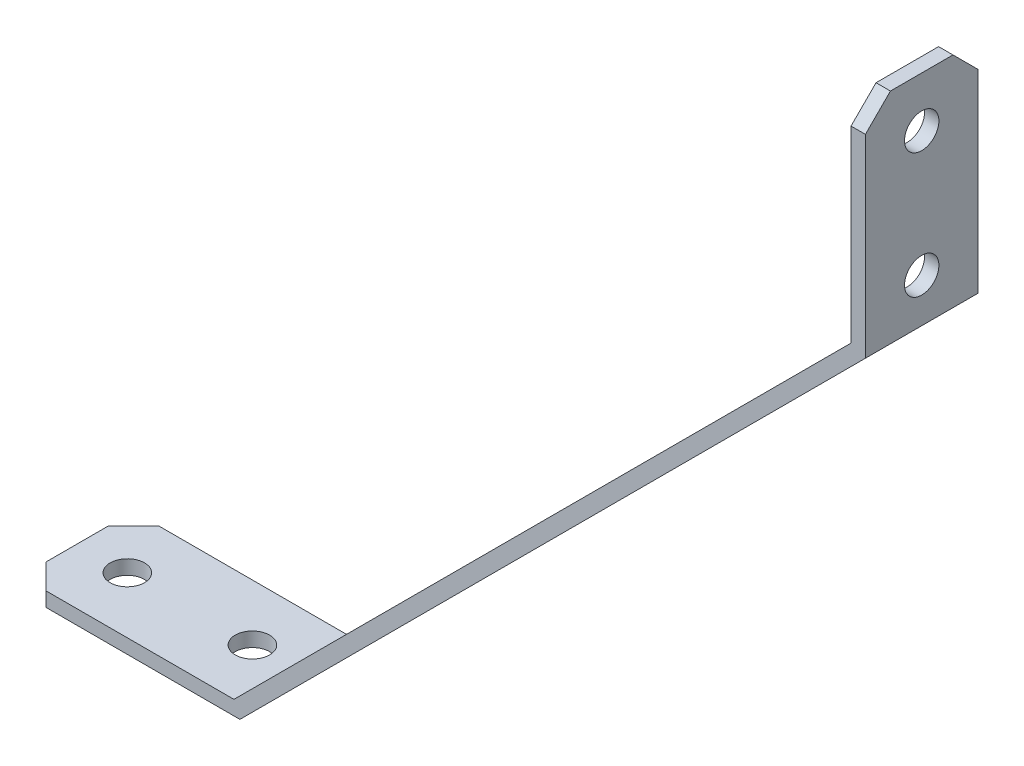
ISO-10303-21;
HEADER;
FILE_DESCRIPTION(('STEP AP214'),'2;1');
FILE_NAME('part.step','',(''),(''),'','','');
FILE_SCHEMA(('AUTOMOTIVE_DESIGN { 1 0 10303 214 1 1 1 1 }'));
ENDSEC;
DATA;
#1=APPLICATION_CONTEXT('core data for automotive mechanical design processes');
#2=APPLICATION_PROTOCOL_DEFINITION('international standard','automotive_design',2000,#1);
#3=PRODUCT_CONTEXT('',#1,'mechanical');
#4=PRODUCT('Part','Part','',(#3));
#5=PRODUCT_RELATED_PRODUCT_CATEGORY('part','',(#4));
#6=PRODUCT_DEFINITION_FORMATION('','',#4);
#7=PRODUCT_DEFINITION_CONTEXT('part definition',#1,'design');
#8=PRODUCT_DEFINITION('design','',#6,#7);
#9=PRODUCT_DEFINITION_SHAPE('','',#8);
#10=(LENGTH_UNIT() NAMED_UNIT(*) SI_UNIT(.MILLI.,.METRE.));
#11=(NAMED_UNIT(*) PLANE_ANGLE_UNIT() SI_UNIT($,.RADIAN.));
#12=(NAMED_UNIT(*) SI_UNIT($,.STERADIAN.) SOLID_ANGLE_UNIT());
#13=UNCERTAINTY_MEASURE_WITH_UNIT(LENGTH_MEASURE(1.E-05),#10,'distance_accuracy_value','');
#14=(GEOMETRIC_REPRESENTATION_CONTEXT(3) GLOBAL_UNCERTAINTY_ASSIGNED_CONTEXT((#13)) GLOBAL_UNIT_ASSIGNED_CONTEXT((#10,
#11,#12)) REPRESENTATION_CONTEXT('',''));
#15=CARTESIAN_POINT('',(0.,0.,0.));
#16=DIRECTION('',(0.,0.,1.));
#17=DIRECTION('',(1.,0.,0.));
#18=AXIS2_PLACEMENT_3D('',#15,#16,#17);
#19=CARTESIAN_POINT('',(0.,2.3,18.));
#20=DIRECTION('',(1.,0.,0.));
#21=DIRECTION('',(0.,1.,0.));
#22=AXIS2_PLACEMENT_3D('',#19,#20,#21);
#23=PLANE('',#22);
#24=DIRECTION('',(0.,0.,-1.));
#25=VECTOR('',#24,1.);
#26=CARTESIAN_POINT('',(0.,2.3,18.));
#27=LINE('',#26,#25);
#28=CARTESIAN_POINT('',(0.,2.3,14.));
#29=VERTEX_POINT('',#28);
#30=CARTESIAN_POINT('',(0.,2.3,4.00000000000001));
#31=VERTEX_POINT('',#30);
#32=EDGE_CURVE('E160',#29,#31,#27,.T.);
#33=ORIENTED_EDGE('',*,*,#32,.T.);
#34=DIRECTION('',(0.,-1.,0.));
#35=VECTOR('',#34,1.);
#36=CARTESIAN_POINT('',(0.,2.3,4.));
#37=LINE('',#36,#35);
#38=CARTESIAN_POINT('',(0.,0.,4.00000000000001));
#39=VERTEX_POINT('',#38);
#40=EDGE_CURVE('E218',#31,#39,#37,.T.);
#41=ORIENTED_EDGE('',*,*,#40,.T.);
#42=DIRECTION('',(0.,0.,-1.));
#43=VECTOR('',#42,1.);
#44=CARTESIAN_POINT('',(0.,0.,18.));
#45=LINE('',#44,#43);
#46=CARTESIAN_POINT('',(0.,0.,14.));
#47=VERTEX_POINT('',#46);
#48=EDGE_CURVE('E143',#47,#39,#45,.T.);
#49=ORIENTED_EDGE('',*,*,#48,.F.);
#50=DIRECTION('',(0.,1.,0.));
#51=VECTOR('',#50,1.);
#52=CARTESIAN_POINT('',(0.,2.3,14.));
#53=LINE('',#52,#51);
#54=EDGE_CURVE('E207',#47,#29,#53,.T.);
#55=ORIENTED_EDGE('',*,*,#54,.T.);
#56=EDGE_LOOP('',(#33,#41,#49,#55));
#57=FACE_BOUND('',#56,.T.);
#58=ADVANCED_FACE('F33',(#57),#23,.F.);
#59=CARTESIAN_POINT('',(0.,0.,18.));
#60=DIRECTION('',(0.,1.,0.));
#61=DIRECTION('',(0.,0.,1.));
#62=AXIS2_PLACEMENT_3D('',#59,#60,#61);
#63=PLANE('',#62);
#64=CARTESIAN_POINT('',(28.,0.,9.));
#65=DIRECTION('',(0.,-1.,0.));
#66=DIRECTION('',(0.,0.,-1.));
#67=AXIS2_PLACEMENT_3D('',#64,#65,#66);
#68=CIRCLE('',#67,2.75);
#69=CARTESIAN_POINT('',(28.,0.,6.25));
#70=VERTEX_POINT('',#69);
#71=EDGE_CURVE('E216',#70,#70,#68,.T.);
#72=ORIENTED_EDGE('',*,*,#71,.F.);
#73=EDGE_LOOP('',(#72));
#74=FACE_BOUND('',#73,.T.);
#75=CARTESIAN_POINT('',(8.00000000000001,0.,9.));
#76=DIRECTION('',(0.,-1.,0.));
#77=DIRECTION('',(0.,0.,-1.));
#78=AXIS2_PLACEMENT_3D('',#75,#76,#77);
#79=CIRCLE('',#78,2.75);
#80=CARTESIAN_POINT('',(8.00000000000001,0.,6.25));
#81=VERTEX_POINT('',#80);
#82=EDGE_CURVE('E212',#81,#81,#79,.T.);
#83=ORIENTED_EDGE('',*,*,#82,.F.);
#84=EDGE_LOOP('',(#83));
#85=FACE_BOUND('',#84,.T.);
#86=ORIENTED_EDGE('',*,*,#48,.T.);
#87=DIRECTION('',(-0.707106781186548,0.,0.707106781186548));
#88=VECTOR('',#87,1.);
#89=CARTESIAN_POINT('',(0.,0.,4.));
#90=LINE('',#89,#88);
#91=CARTESIAN_POINT('',(4.,0.,0.));
#92=VERTEX_POINT('',#91);
#93=EDGE_CURVE('E223',#39,#92,#90,.F.);
#94=ORIENTED_EDGE('',*,*,#93,.T.);
#95=DIRECTION('',(1.,0.,0.));
#96=VECTOR('',#95,1.);
#97=CARTESIAN_POINT('',(0.,0.,0.));
#98=LINE('',#97,#96);
#99=CARTESIAN_POINT('',(35.,0.,0.));
#100=VERTEX_POINT('',#99);
#101=EDGE_CURVE('E140',#92,#100,#98,.T.);
#102=ORIENTED_EDGE('',*,*,#101,.T.);
#103=DIRECTION('',(0.,0.,-1.));
#104=VECTOR('',#103,1.);
#105=CARTESIAN_POINT('',(35.,0.,18.));
#106=LINE('',#105,#104);
#107=CARTESIAN_POINT('',(35.,0.,18.));
#108=VERTEX_POINT('',#107);
#109=EDGE_CURVE('E137',#108,#100,#106,.T.);
#110=ORIENTED_EDGE('',*,*,#109,.F.);
#111=DIRECTION('',(1.,0.,0.));
#112=VECTOR('',#111,1.);
#113=CARTESIAN_POINT('',(0.,0.,18.));
#114=LINE('',#113,#112);
#115=CARTESIAN_POINT('',(4.,0.,18.));
#116=VERTEX_POINT('',#115);
#117=EDGE_CURVE('E125',#116,#108,#114,.T.);
#118=ORIENTED_EDGE('',*,*,#117,.F.);
#119=DIRECTION('',(-0.707106781186548,0.,-0.707106781186548));
#120=VECTOR('',#119,1.);
#121=CARTESIAN_POINT('',(4.,0.,18.));
#122=LINE('',#121,#120);
#123=EDGE_CURVE('E221',#116,#47,#122,.T.);
#124=ORIENTED_EDGE('',*,*,#123,.T.);
#125=EDGE_LOOP('',(#86,#94,#102,#110,#118,#124));
#126=FACE_BOUND('',#125,.T.);
#127=ADVANCED_FACE('F139',(#74,#85,#126),#63,.F.);
#128=CARTESIAN_POINT('',(35.,0.,18.));
#129=DIRECTION('',(-0.707106781186548,0.707106781186547,0.));
#130=DIRECTION('',(-0.707106781186547,-0.707106781186548,0.));
#131=AXIS2_PLACEMENT_3D('',#128,#129,#130);
#132=PLANE('',#131);
#133=DIRECTION('',(0.707106781186547,0.707106781186548,0.));
#134=VECTOR('',#133,1.);
#135=CARTESIAN_POINT('',(35.,0.,0.));
#136=LINE('',#135,#134);
#137=CARTESIAN_POINT('',(135.,100.,0.));
#138=VERTEX_POINT('',#137);
#139=EDGE_CURVE('E162',#100,#138,#136,.T.);
#140=ORIENTED_EDGE('',*,*,#139,.T.);
#141=DIRECTION('',(0.,0.,-1.));
#142=VECTOR('',#141,1.);
#143=CARTESIAN_POINT('',(135.,100.,18.));
#144=LINE('',#143,#142);
#145=CARTESIAN_POINT('',(135.,100.,18.));
#146=VERTEX_POINT('',#145);
#147=EDGE_CURVE('E144',#146,#138,#144,.T.);
#148=ORIENTED_EDGE('',*,*,#147,.F.);
#149=DIRECTION('',(0.707106781186547,0.707106781186548,0.));
#150=VECTOR('',#149,1.);
#151=CARTESIAN_POINT('',(35.,0.,18.));
#152=LINE('',#151,#150);
#153=EDGE_CURVE('E130',#108,#146,#152,.T.);
#154=ORIENTED_EDGE('',*,*,#153,.F.);
#155=ORIENTED_EDGE('',*,*,#109,.T.);
#156=EDGE_LOOP('',(#140,#148,#154,#155));
#157=FACE_BOUND('',#156,.T.);
#158=ADVANCED_FACE('F146',(#157),#132,.F.);
#159=CARTESIAN_POINT('',(135.,100.,18.));
#160=DIRECTION('',(-1.,0.,0.));
#161=DIRECTION('',(0.,-1.,0.));
#162=AXIS2_PLACEMENT_3D('',#159,#160,#161);
#163=PLANE('',#162);
#164=CARTESIAN_POINT('',(135.,107.,9.));
#165=DIRECTION('',(-1.,0.,0.));
#166=DIRECTION('',(0.,0.,1.));
#167=AXIS2_PLACEMENT_3D('',#164,#165,#166);
#168=CIRCLE('',#167,2.75);
#169=CARTESIAN_POINT('',(135.,107.,11.75));
#170=VERTEX_POINT('',#169);
#171=EDGE_CURVE('E422',#170,#170,#168,.T.);
#172=ORIENTED_EDGE('',*,*,#171,.T.);
#173=EDGE_LOOP('',(#172));
#174=FACE_BOUND('',#173,.T.);
#175=CARTESIAN_POINT('',(135.,127.,9.));
#176=DIRECTION('',(-1.,0.,0.));
#177=DIRECTION('',(0.,0.,1.));
#178=AXIS2_PLACEMENT_3D('',#175,#176,#177);
#179=CIRCLE('',#178,2.75);
#180=CARTESIAN_POINT('',(135.,127.,11.75));
#181=VERTEX_POINT('',#180);
#182=EDGE_CURVE('E163',#181,#181,#179,.T.);
#183=ORIENTED_EDGE('',*,*,#182,.T.);
#184=EDGE_LOOP('',(#183));
#185=FACE_BOUND('',#184,.T.);
#186=DIRECTION('',(0.,0.,-1.));
#187=VECTOR('',#186,1.);
#188=CARTESIAN_POINT('',(135.,135.,18.));
#189=LINE('',#188,#187);
#190=CARTESIAN_POINT('',(135.,135.,14.));
#191=VERTEX_POINT('',#190);
#192=CARTESIAN_POINT('',(135.,135.,4.00000000000001));
#193=VERTEX_POINT('',#192);
#194=EDGE_CURVE('E184',#191,#193,#189,.T.);
#195=ORIENTED_EDGE('',*,*,#194,.F.);
#196=DIRECTION('',(0.,-0.707106781186545,0.70710678118655));
#197=VECTOR('',#196,1.);
#198=CARTESIAN_POINT('',(135.,131.,18.));
#199=LINE('',#198,#197);
#200=CARTESIAN_POINT('',(135.,131.,18.));
#201=VERTEX_POINT('',#200);
#202=EDGE_CURVE('E203',#191,#201,#199,.T.);
#203=ORIENTED_EDGE('',*,*,#202,.T.);
#204=DIRECTION('',(0.,1.,0.));
#205=VECTOR('',#204,1.);
#206=CARTESIAN_POINT('',(135.,100.,18.));
#207=LINE('',#206,#205);
#208=EDGE_CURVE('E149',#146,#201,#207,.T.);
#209=ORIENTED_EDGE('',*,*,#208,.F.);
#210=ORIENTED_EDGE('',*,*,#147,.T.);
#211=DIRECTION('',(0.,1.,0.));
#212=VECTOR('',#211,1.);
#213=CARTESIAN_POINT('',(135.,100.,0.));
#214=LINE('',#213,#212);
#215=CARTESIAN_POINT('',(135.,131.,0.));
#216=VERTEX_POINT('',#215);
#217=EDGE_CURVE('E165',#138,#216,#214,.T.);
#218=ORIENTED_EDGE('',*,*,#217,.T.);
#219=DIRECTION('',(0.,-0.707106781186548,-0.707106781186548));
#220=VECTOR('',#219,1.);
#221=CARTESIAN_POINT('',(135.,135.,4.));
#222=LINE('',#221,#220);
#223=EDGE_CURVE('E201',#216,#193,#222,.F.);
#224=ORIENTED_EDGE('',*,*,#223,.T.);
#225=EDGE_LOOP('',(#195,#203,#209,#210,#218,#224));
#226=FACE_BOUND('',#225,.T.);
#227=ADVANCED_FACE('F238',(#174,#185,#226),#163,.F.);
#228=CARTESIAN_POINT('',(135.,135.,18.));
#229=DIRECTION('',(0.,-1.,0.));
#230=DIRECTION('',(0.,0.,-1.));
#231=AXIS2_PLACEMENT_3D('',#228,#229,#230);
#232=PLANE('',#231);
#233=DIRECTION('',(0.,0.,-1.));
#234=VECTOR('',#233,1.);
#235=CARTESIAN_POINT('',(132.7,135.,18.));
#236=LINE('',#235,#234);
#237=CARTESIAN_POINT('',(132.7,135.,14.));
#238=VERTEX_POINT('',#237);
#239=CARTESIAN_POINT('',(132.7,135.,4.00000000000001));
#240=VERTEX_POINT('',#239);
#241=EDGE_CURVE('E181',#238,#240,#236,.T.);
#242=ORIENTED_EDGE('',*,*,#241,.F.);
#243=DIRECTION('',(1.,0.,0.));
#244=VECTOR('',#243,1.);
#245=CARTESIAN_POINT('',(135.,135.,14.));
#246=LINE('',#245,#244);
#247=EDGE_CURVE('E199',#238,#191,#246,.T.);
#248=ORIENTED_EDGE('',*,*,#247,.T.);
#249=ORIENTED_EDGE('',*,*,#194,.T.);
#250=DIRECTION('',(-1.,0.,0.));
#251=VECTOR('',#250,1.);
#252=CARTESIAN_POINT('',(135.,135.,4.));
#253=LINE('',#252,#251);
#254=EDGE_CURVE('E196',#193,#240,#253,.T.);
#255=ORIENTED_EDGE('',*,*,#254,.T.);
#256=EDGE_LOOP('',(#242,#248,#249,#255));
#257=FACE_BOUND('',#256,.T.);
#258=ADVANCED_FACE('F251',(#257),#232,.F.);
#259=CARTESIAN_POINT('',(132.7,135.,18.));
#260=DIRECTION('',(1.,0.,0.));
#261=DIRECTION('',(0.,0.,-1.));
#262=AXIS2_PLACEMENT_3D('',#259,#260,#261);
#263=PLANE('',#262);
#264=CARTESIAN_POINT('',(132.7,107.,9.));
#265=DIRECTION('',(-1.,0.,0.));
#266=DIRECTION('',(0.,0.,1.));
#267=AXIS2_PLACEMENT_3D('',#264,#265,#266);
#268=CIRCLE('',#267,2.75);
#269=CARTESIAN_POINT('',(132.7,107.,11.75));
#270=VERTEX_POINT('',#269);
#271=EDGE_CURVE('E211',#270,#270,#268,.T.);
#272=ORIENTED_EDGE('',*,*,#271,.F.);
#273=EDGE_LOOP('',(#272));
#274=FACE_BOUND('',#273,.T.);
#275=CARTESIAN_POINT('',(132.7,127.,9.));
#276=DIRECTION('',(-1.,0.,0.));
#277=DIRECTION('',(0.,0.,1.));
#278=AXIS2_PLACEMENT_3D('',#275,#276,#277);
#279=CIRCLE('',#278,2.75);
#280=CARTESIAN_POINT('',(132.7,127.,11.75));
#281=VERTEX_POINT('',#280);
#282=EDGE_CURVE('E425',#281,#281,#279,.T.);
#283=ORIENTED_EDGE('',*,*,#282,.F.);
#284=EDGE_LOOP('',(#283));
#285=FACE_BOUND('',#284,.T.);
#286=DIRECTION('',(0.,-1.,0.));
#287=VECTOR('',#286,1.);
#288=CARTESIAN_POINT('',(132.7,135.,18.));
#289=LINE('',#288,#287);
#290=CARTESIAN_POINT('',(132.7,131.,18.));
#291=VERTEX_POINT('',#290);
#292=CARTESIAN_POINT('',(132.7,100.952691193458,18.));
#293=VERTEX_POINT('',#292);
#294=EDGE_CURVE('E151',#291,#293,#289,.T.);
#295=ORIENTED_EDGE('',*,*,#294,.F.);
#296=DIRECTION('',(0.,0.707106781186545,-0.70710678118655));
#297=VECTOR('',#296,1.);
#298=CARTESIAN_POINT('',(132.7,131.,18.));
#299=LINE('',#298,#297);
#300=EDGE_CURVE('E194',#291,#238,#299,.T.);
#301=ORIENTED_EDGE('',*,*,#300,.T.);
#302=ORIENTED_EDGE('',*,*,#241,.T.);
#303=DIRECTION('',(0.,0.707106781186548,0.707106781186548));
#304=VECTOR('',#303,1.);
#305=CARTESIAN_POINT('',(132.7,135.,4.));
#306=LINE('',#305,#304);
#307=CARTESIAN_POINT('',(132.7,131.,0.));
#308=VERTEX_POINT('',#307);
#309=EDGE_CURVE('E192',#240,#308,#306,.F.);
#310=ORIENTED_EDGE('',*,*,#309,.T.);
#311=DIRECTION('',(0.,-1.,0.));
#312=VECTOR('',#311,1.);
#313=CARTESIAN_POINT('',(132.7,135.,0.));
#314=LINE('',#313,#312);
#315=CARTESIAN_POINT('',(132.7,100.952691193458,0.));
#316=VERTEX_POINT('',#315);
#317=EDGE_CURVE('E168',#308,#316,#314,.T.);
#318=ORIENTED_EDGE('',*,*,#317,.T.);
#319=DIRECTION('',(0.,0.,-1.));
#320=VECTOR('',#319,1.);
#321=CARTESIAN_POINT('',(132.7,100.952691193458,18.));
#322=LINE('',#321,#320);
#323=EDGE_CURVE('E178',#293,#316,#322,.T.);
#324=ORIENTED_EDGE('',*,*,#323,.F.);
#325=EDGE_LOOP('',(#295,#301,#302,#310,#318,#324));
#326=FACE_BOUND('',#325,.T.);
#327=ADVANCED_FACE('F248',(#274,#285,#326),#263,.F.);
#328=CARTESIAN_POINT('',(132.7,100.952691193458,18.));
#329=DIRECTION('',(0.707106781186548,-0.707106781186547,0.));
#330=DIRECTION('',(0.707106781186547,0.707106781186548,0.));
#331=AXIS2_PLACEMENT_3D('',#328,#329,#330);
#332=PLANE('',#331);
#333=DIRECTION('',(-0.707106781186547,-0.707106781186548,0.));
#334=VECTOR('',#333,1.);
#335=CARTESIAN_POINT('',(132.7,100.952691193458,0.));
#336=LINE('',#335,#334);
#337=CARTESIAN_POINT('',(34.0473088065419,2.3,0.));
#338=VERTEX_POINT('',#337);
#339=EDGE_CURVE('E170',#316,#338,#336,.T.);
#340=ORIENTED_EDGE('',*,*,#339,.T.);
#341=DIRECTION('',(0.,0.,-1.));
#342=VECTOR('',#341,1.);
#343=CARTESIAN_POINT('',(34.0473088065419,2.3,18.));
#344=LINE('',#343,#342);
#345=CARTESIAN_POINT('',(34.0473088065419,2.3,18.));
#346=VERTEX_POINT('',#345);
#347=EDGE_CURVE('E175',#346,#338,#344,.T.);
#348=ORIENTED_EDGE('',*,*,#347,.F.);
#349=DIRECTION('',(-0.707106781186547,-0.707106781186548,0.));
#350=VECTOR('',#349,1.);
#351=CARTESIAN_POINT('',(132.7,100.952691193458,18.));
#352=LINE('',#351,#350);
#353=EDGE_CURVE('E156',#293,#346,#352,.T.);
#354=ORIENTED_EDGE('',*,*,#353,.F.);
#355=ORIENTED_EDGE('',*,*,#323,.T.);
#356=EDGE_LOOP('',(#340,#348,#354,#355));
#357=FACE_BOUND('',#356,.T.);
#358=ADVANCED_FACE('F260',(#357),#332,.F.);
#359=CARTESIAN_POINT('',(34.0473088065419,2.3,18.));
#360=DIRECTION('',(0.,-1.,0.));
#361=DIRECTION('',(0.,0.,-1.));
#362=AXIS2_PLACEMENT_3D('',#359,#360,#361);
#363=PLANE('',#362);
#364=CARTESIAN_POINT('',(28.,2.3,9.));
#365=DIRECTION('',(0.,-1.,0.));
#366=DIRECTION('',(0.,0.,-1.));
#367=AXIS2_PLACEMENT_3D('',#364,#365,#366);
#368=CIRCLE('',#367,2.75);
#369=CARTESIAN_POINT('',(28.,2.3,6.25));
#370=VERTEX_POINT('',#369);
#371=EDGE_CURVE('E213',#370,#370,#368,.T.);
#372=ORIENTED_EDGE('',*,*,#371,.T.);
#373=EDGE_LOOP('',(#372));
#374=FACE_BOUND('',#373,.T.);
#375=CARTESIAN_POINT('',(8.00000000000001,2.3,9.));
#376=DIRECTION('',(0.,-1.,0.));
#377=DIRECTION('',(0.,0.,-1.));
#378=AXIS2_PLACEMENT_3D('',#375,#376,#377);
#379=CIRCLE('',#378,2.75);
#380=CARTESIAN_POINT('',(8.00000000000001,2.3,6.25));
#381=VERTEX_POINT('',#380);
#382=EDGE_CURVE('E208',#381,#381,#379,.T.);
#383=ORIENTED_EDGE('',*,*,#382,.T.);
#384=EDGE_LOOP('',(#383));
#385=FACE_BOUND('',#384,.T.);
#386=DIRECTION('',(-1.,0.,0.));
#387=VECTOR('',#386,1.);
#388=CARTESIAN_POINT('',(34.0473088065419,2.3,0.));
#389=LINE('',#388,#387);
#390=CARTESIAN_POINT('',(4.00000000000001,2.3,0.));
#391=VERTEX_POINT('',#390);
#392=EDGE_CURVE('E134',#338,#391,#389,.T.);
#393=ORIENTED_EDGE('',*,*,#392,.T.);
#394=DIRECTION('',(0.707106781186548,0.,-0.707106781186548));
#395=VECTOR('',#394,1.);
#396=CARTESIAN_POINT('',(0.,2.3,4.));
#397=LINE('',#396,#395);
#398=EDGE_CURVE('E41',#391,#31,#397,.F.);
#399=ORIENTED_EDGE('',*,*,#398,.T.);
#400=ORIENTED_EDGE('',*,*,#32,.F.);
#401=DIRECTION('',(0.707106781186548,0.,0.707106781186548));
#402=VECTOR('',#401,1.);
#403=CARTESIAN_POINT('',(4.,2.3,18.));
#404=LINE('',#403,#402);
#405=CARTESIAN_POINT('',(4.00000000000001,2.3,18.));
#406=VERTEX_POINT('',#405);
#407=EDGE_CURVE('E48',#29,#406,#404,.T.);
#408=ORIENTED_EDGE('',*,*,#407,.T.);
#409=DIRECTION('',(-1.,0.,0.));
#410=VECTOR('',#409,1.);
#411=CARTESIAN_POINT('',(34.0473088065419,2.3,18.));
#412=LINE('',#411,#410);
#413=EDGE_CURVE('E158',#346,#406,#412,.T.);
#414=ORIENTED_EDGE('',*,*,#413,.F.);
#415=ORIENTED_EDGE('',*,*,#347,.T.);
#416=EDGE_LOOP('',(#393,#399,#400,#408,#414,#415));
#417=FACE_BOUND('',#416,.T.);
#418=ADVANCED_FACE('F227',(#374,#385,#417),#363,.F.);
#419=CARTESIAN_POINT('',(0.,0.,18.));
#420=DIRECTION('',(0.,0.,1.));
#421=DIRECTION('',(1.,0.,0.));
#422=AXIS2_PLACEMENT_3D('',#419,#420,#421);
#423=PLANE('',#422);
#424=ORIENTED_EDGE('',*,*,#413,.T.);
#425=DIRECTION('',(0.,-1.,0.));
#426=VECTOR('',#425,1.);
#427=CARTESIAN_POINT('',(4.,0.,18.));
#428=LINE('',#427,#426);
#429=EDGE_CURVE('E11',#406,#116,#428,.T.);
#430=ORIENTED_EDGE('',*,*,#429,.T.);
#431=ORIENTED_EDGE('',*,*,#117,.T.);
#432=ORIENTED_EDGE('',*,*,#153,.T.);
#433=ORIENTED_EDGE('',*,*,#208,.T.);
#434=DIRECTION('',(-1.,0.,0.));
#435=VECTOR('',#434,1.);
#436=CARTESIAN_POINT('',(132.7,131.,18.));
#437=LINE('',#436,#435);
#438=EDGE_CURVE('E189',#201,#291,#437,.T.);
#439=ORIENTED_EDGE('',*,*,#438,.T.);
#440=ORIENTED_EDGE('',*,*,#294,.T.);
#441=ORIENTED_EDGE('',*,*,#353,.T.);
#442=EDGE_LOOP('',(#424,#430,#431,#432,#433,#439,#440,#441));
#443=FACE_BOUND('',#442,.T.);
#444=ADVANCED_FACE('F127',(#443),#423,.T.);
#445=CARTESIAN_POINT('',(0.,0.,0.));
#446=DIRECTION('',(0.,0.,1.));
#447=DIRECTION('',(1.,0.,0.));
#448=AXIS2_PLACEMENT_3D('',#445,#446,#447);
#449=PLANE('',#448);
#450=ORIENTED_EDGE('',*,*,#101,.F.);
#451=DIRECTION('',(0.,1.,0.));
#452=VECTOR('',#451,1.);
#453=CARTESIAN_POINT('',(4.,0.,0.));
#454=LINE('',#453,#452);
#455=EDGE_CURVE('E56',#92,#391,#454,.T.);
#456=ORIENTED_EDGE('',*,*,#455,.T.);
#457=ORIENTED_EDGE('',*,*,#392,.F.);
#458=ORIENTED_EDGE('',*,*,#339,.F.);
#459=ORIENTED_EDGE('',*,*,#317,.F.);
#460=DIRECTION('',(1.,0.,0.));
#461=VECTOR('',#460,1.);
#462=CARTESIAN_POINT('',(0.,131.,0.));
#463=LINE('',#462,#461);
#464=EDGE_CURVE('E205',#308,#216,#463,.T.);
#465=ORIENTED_EDGE('',*,*,#464,.T.);
#466=ORIENTED_EDGE('',*,*,#217,.F.);
#467=ORIENTED_EDGE('',*,*,#139,.F.);
#468=EDGE_LOOP('',(#450,#456,#457,#458,#459,#465,#466,#467));
#469=FACE_BOUND('',#468,.T.);
#470=ADVANCED_FACE('F234',(#469),#449,.F.);
#471=CARTESIAN_POINT('',(135.,127.,9.));
#472=DIRECTION('',(-1.,0.,0.));
#473=DIRECTION('',(0.,0.,1.));
#474=AXIS2_PLACEMENT_3D('',#471,#472,#473);
#475=CYLINDRICAL_SURFACE('',#474,2.75);
#476=ORIENTED_EDGE('',*,*,#182,.F.);
#477=EDGE_LOOP('',(#476));
#478=FACE_BOUND('',#477,.T.);
#479=ORIENTED_EDGE('',*,*,#282,.T.);
#480=EDGE_LOOP('',(#479));
#481=FACE_BOUND('',#480,.T.);
#482=ADVANCED_FACE('F297',(#478,#481),#475,.F.);
#483=CARTESIAN_POINT('',(135.,107.,9.));
#484=DIRECTION('',(-1.,0.,0.));
#485=DIRECTION('',(0.,0.,1.));
#486=AXIS2_PLACEMENT_3D('',#483,#484,#485);
#487=CYLINDRICAL_SURFACE('',#486,2.75);
#488=ORIENTED_EDGE('',*,*,#171,.F.);
#489=EDGE_LOOP('',(#488));
#490=FACE_BOUND('',#489,.T.);
#491=ORIENTED_EDGE('',*,*,#271,.T.);
#492=EDGE_LOOP('',(#491));
#493=FACE_BOUND('',#492,.T.);
#494=ADVANCED_FACE('F279',(#490,#493),#487,.F.);
#495=CARTESIAN_POINT('',(0.,131.,18.));
#496=DIRECTION('',(0.,0.70710678118655,0.707106781186545));
#497=DIRECTION('',(1.,0.,0.));
#498=AXIS2_PLACEMENT_3D('',#495,#496,#497);
#499=PLANE('',#498);
#500=ORIENTED_EDGE('',*,*,#202,.F.);
#501=ORIENTED_EDGE('',*,*,#247,.F.);
#502=ORIENTED_EDGE('',*,*,#300,.F.);
#503=ORIENTED_EDGE('',*,*,#438,.F.);
#504=EDGE_LOOP('',(#500,#501,#502,#503));
#505=FACE_BOUND('',#504,.T.);
#506=ADVANCED_FACE('F244',(#505),#499,.T.);
#507=CARTESIAN_POINT('',(135.,135.,4.));
#508=DIRECTION('',(0.,-0.707106781186547,0.707106781186547));
#509=DIRECTION('',(-1.,0.,0.));
#510=AXIS2_PLACEMENT_3D('',#507,#508,#509);
#511=PLANE('',#510);
#512=ORIENTED_EDGE('',*,*,#223,.F.);
#513=ORIENTED_EDGE('',*,*,#464,.F.);
#514=ORIENTED_EDGE('',*,*,#309,.F.);
#515=ORIENTED_EDGE('',*,*,#254,.F.);
#516=EDGE_LOOP('',(#512,#513,#514,#515));
#517=FACE_BOUND('',#516,.T.);
#518=ADVANCED_FACE('F254',(#517),#511,.F.);
#519=CARTESIAN_POINT('',(8.00000000000001,135.,9.));
#520=DIRECTION('',(0.,-1.,0.));
#521=DIRECTION('',(0.,0.,-1.));
#522=AXIS2_PLACEMENT_3D('',#519,#520,#521);
#523=CYLINDRICAL_SURFACE('',#522,2.75);
#524=ORIENTED_EDGE('',*,*,#82,.T.);
#525=EDGE_LOOP('',(#524));
#526=FACE_BOUND('',#525,.T.);
#527=ORIENTED_EDGE('',*,*,#382,.F.);
#528=EDGE_LOOP('',(#527));
#529=FACE_BOUND('',#528,.T.);
#530=ADVANCED_FACE('F281',(#526,#529),#523,.F.);
#531=CARTESIAN_POINT('',(28.,135.,9.));
#532=DIRECTION('',(0.,-1.,0.));
#533=DIRECTION('',(0.,0.,-1.));
#534=AXIS2_PLACEMENT_3D('',#531,#532,#533);
#535=CYLINDRICAL_SURFACE('',#534,2.75);
#536=ORIENTED_EDGE('',*,*,#71,.T.);
#537=EDGE_LOOP('',(#536));
#538=FACE_BOUND('',#537,.T.);
#539=ORIENTED_EDGE('',*,*,#371,.F.);
#540=EDGE_LOOP('',(#539));
#541=FACE_BOUND('',#540,.T.);
#542=ADVANCED_FACE('F267',(#538,#541),#535,.F.);
#543=CARTESIAN_POINT('',(0.,2.3,4.));
#544=DIRECTION('',(0.707106781186547,0.,0.707106781186547));
#545=DIRECTION('',(0.,-1.,0.));
#546=AXIS2_PLACEMENT_3D('',#543,#544,#545);
#547=PLANE('',#546);
#548=ORIENTED_EDGE('',*,*,#398,.F.);
#549=ORIENTED_EDGE('',*,*,#455,.F.);
#550=ORIENTED_EDGE('',*,*,#93,.F.);
#551=ORIENTED_EDGE('',*,*,#40,.F.);
#552=EDGE_LOOP('',(#548,#549,#550,#551));
#553=FACE_BOUND('',#552,.T.);
#554=ADVANCED_FACE('F233',(#553),#547,.F.);
#555=CARTESIAN_POINT('',(4.,0.,18.));
#556=DIRECTION('',(-0.707106781186547,0.,0.707106781186547));
#557=DIRECTION('',(0.,1.,0.));
#558=AXIS2_PLACEMENT_3D('',#555,#556,#557);
#559=PLANE('',#558);
#560=ORIENTED_EDGE('',*,*,#407,.F.);
#561=ORIENTED_EDGE('',*,*,#54,.F.);
#562=ORIENTED_EDGE('',*,*,#123,.F.);
#563=ORIENTED_EDGE('',*,*,#429,.F.);
#564=EDGE_LOOP('',(#560,#561,#562,#563));
#565=FACE_BOUND('',#564,.T.);
#566=ADVANCED_FACE('F35',(#565),#559,.T.);
#567=CLOSED_SHELL('',(#58,#127,#158,#227,#258,#327,#358,#418,#444,#470,#482,#494,#506,#518,#530,
#542,#554,#566));
#568=MANIFOLD_SOLID_BREP('B2',#567);
#569=ADVANCED_BREP_SHAPE_REPRESENTATION('',(#18,#568),#14);
#570=SHAPE_DEFINITION_REPRESENTATION(#9,#569);
ENDSEC;
END-ISO-10303-21;
